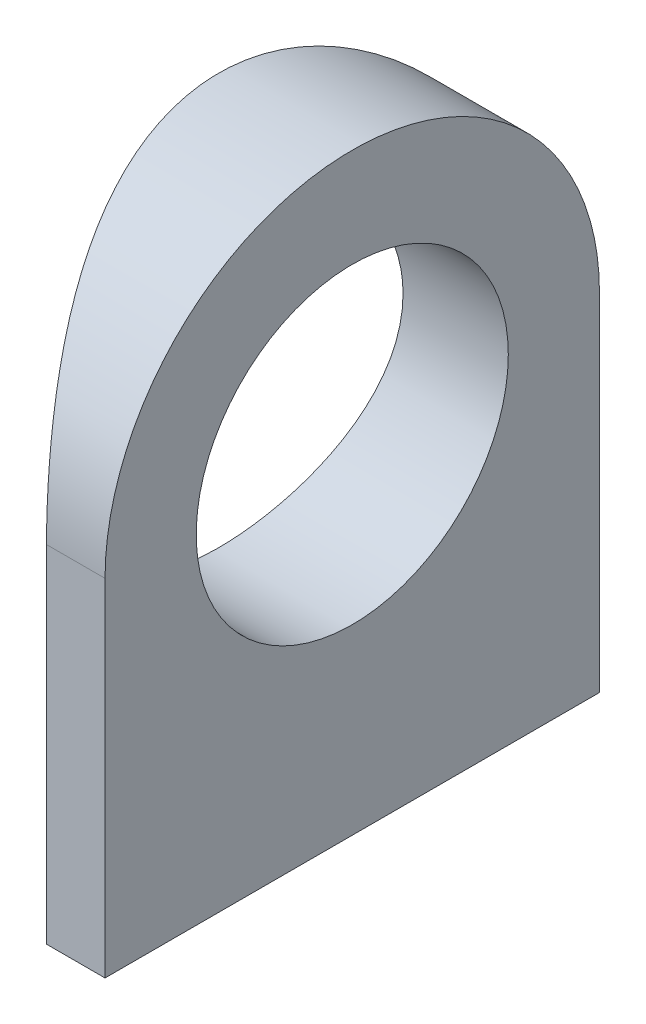
ISO-10303-21;
HEADER;
FILE_DESCRIPTION(('STEP AP214'),'2;1');
FILE_NAME('part.step','',(''),(''),'','','');
FILE_SCHEMA(('AUTOMOTIVE_DESIGN { 1 0 10303 214 1 1 1 1 }'));
ENDSEC;
DATA;
#1=APPLICATION_CONTEXT('core data for automotive mechanical design processes');
#2=APPLICATION_PROTOCOL_DEFINITION('international standard','automotive_design',2000,#1);
#3=PRODUCT_CONTEXT('',#1,'mechanical');
#4=PRODUCT('Part','Part','',(#3));
#5=PRODUCT_RELATED_PRODUCT_CATEGORY('part','',(#4));
#6=PRODUCT_DEFINITION_FORMATION('','',#4);
#7=PRODUCT_DEFINITION_CONTEXT('part definition',#1,'design');
#8=PRODUCT_DEFINITION('design','',#6,#7);
#9=PRODUCT_DEFINITION_SHAPE('','',#8);
#10=(LENGTH_UNIT() NAMED_UNIT(*) SI_UNIT(.MILLI.,.METRE.));
#11=(NAMED_UNIT(*) PLANE_ANGLE_UNIT() SI_UNIT($,.RADIAN.));
#12=(NAMED_UNIT(*) SI_UNIT($,.STERADIAN.) SOLID_ANGLE_UNIT());
#13=UNCERTAINTY_MEASURE_WITH_UNIT(LENGTH_MEASURE(1.E-05),#10,'distance_accuracy_value','');
#14=(GEOMETRIC_REPRESENTATION_CONTEXT(3) GLOBAL_UNCERTAINTY_ASSIGNED_CONTEXT((#13)) GLOBAL_UNIT_ASSIGNED_CONTEXT((#10,
#11,#12)) REPRESENTATION_CONTEXT('',''));
#15=CARTESIAN_POINT('',(0.,0.,0.));
#16=DIRECTION('',(0.,0.,1.));
#17=DIRECTION('',(1.,0.,0.));
#18=AXIS2_PLACEMENT_3D('',#15,#16,#17);
#19=CARTESIAN_POINT('',(-31.75,25.4,-15.875));
#20=DIRECTION('',(0.,0.,-1.));
#21=DIRECTION('',(0.,1.,0.));
#22=AXIS2_PLACEMENT_3D('',#19,#20,#21);
#23=PLANE('',#22);
#24=DIRECTION('',(0.,-1.,0.));
#25=VECTOR('',#24,1.);
#26=CARTESIAN_POINT('',(-20.0025,47.625,-15.875));
#27=LINE('',#26,#25);
#28=CARTESIAN_POINT('',(-20.0025,47.625,-15.875));
#29=VERTEX_POINT('',#28);
#30=CARTESIAN_POINT('',(-20.0025,25.4,-15.875));
#31=VERTEX_POINT('',#30);
#32=EDGE_CURVE('E93',#29,#31,#27,.T.);
#33=ORIENTED_EDGE('',*,*,#32,.T.);
#34=DIRECTION('',(-1.,0.,0.));
#35=VECTOR('',#34,1.);
#36=CARTESIAN_POINT('',(-31.75,25.4,-15.875));
#37=LINE('',#36,#35);
#38=CARTESIAN_POINT('',(-23.7595244060145,25.4,-15.875));
#39=VERTEX_POINT('',#38);
#40=EDGE_CURVE('E96',#39,#31,#37,.F.);
#41=ORIENTED_EDGE('',*,*,#40,.F.);
#42=DIRECTION('',(0.,1.,0.));
#43=VECTOR('',#42,1.);
#44=CARTESIAN_POINT('',(-23.7595244060145,25.4,-15.875));
#45=LINE('',#44,#43);
#46=CARTESIAN_POINT('',(-23.7595244060145,47.625,-15.875));
#47=VERTEX_POINT('',#46);
#48=EDGE_CURVE('E110',#39,#47,#45,.T.);
#49=ORIENTED_EDGE('',*,*,#48,.T.);
#50=DIRECTION('',(-1.,0.,0.));
#51=VECTOR('',#50,1.);
#52=CARTESIAN_POINT('',(-20.0025,47.625,-15.875));
#53=LINE('',#52,#51);
#54=EDGE_CURVE('E98',#29,#47,#53,.T.);
#55=ORIENTED_EDGE('',*,*,#54,.F.);
#56=EDGE_LOOP('',(#33,#41,#49,#55));
#57=FACE_BOUND('',#56,.T.);
#58=ADVANCED_FACE('F49',(#57),#23,.T.);
#59=CARTESIAN_POINT('',(-31.75,25.4,15.875));
#60=DIRECTION('',(0.,0.,-1.));
#61=DIRECTION('',(0.,1.,0.));
#62=AXIS2_PLACEMENT_3D('',#59,#60,#61);
#63=PLANE('',#62);
#64=DIRECTION('',(1.,0.,0.));
#65=VECTOR('',#64,1.);
#66=CARTESIAN_POINT('',(-31.75,25.4,15.875));
#67=LINE('',#66,#65);
#68=CARTESIAN_POINT('',(-23.7595244060145,25.4,15.875));
#69=VERTEX_POINT('',#68);
#70=CARTESIAN_POINT('',(-20.0025,25.4,15.875));
#71=VERTEX_POINT('',#70);
#72=EDGE_CURVE('E116',#69,#71,#67,.T.);
#73=ORIENTED_EDGE('',*,*,#72,.T.);
#74=DIRECTION('',(0.,-1.,0.));
#75=VECTOR('',#74,1.);
#76=CARTESIAN_POINT('',(-20.0025,47.625,15.875));
#77=LINE('',#76,#75);
#78=CARTESIAN_POINT('',(-20.0025,47.625,15.875));
#79=VERTEX_POINT('',#78);
#80=EDGE_CURVE('E65',#79,#71,#77,.T.);
#81=ORIENTED_EDGE('',*,*,#80,.F.);
#82=DIRECTION('',(1.,0.,0.));
#83=VECTOR('',#82,1.);
#84=CARTESIAN_POINT('',(-23.7595244060145,47.625,15.875));
#85=LINE('',#84,#83);
#86=CARTESIAN_POINT('',(-23.7595244060145,47.6249999499818,15.875));
#87=VERTEX_POINT('',#86);
#88=EDGE_CURVE('E232',#87,#79,#85,.T.);
#89=ORIENTED_EDGE('',*,*,#88,.F.);
#90=DIRECTION('',(0.,1.,0.));
#91=VECTOR('',#90,1.);
#92=CARTESIAN_POINT('',(-23.7595244060145,0.,15.875));
#93=LINE('',#92,#91);
#94=EDGE_CURVE('E111',#69,#87,#93,.T.);
#95=ORIENTED_EDGE('',*,*,#94,.F.);
#96=EDGE_LOOP('',(#73,#81,#89,#95));
#97=FACE_BOUND('',#96,.T.);
#98=ADVANCED_FACE('F325',(#97),#63,.F.);
#99=CARTESIAN_POINT('',(0.,25.4,0.));
#100=DIRECTION('',(0.,1.,0.));
#101=DIRECTION('',(0.,0.,1.));
#102=AXIS2_PLACEMENT_3D('',#99,#100,#101);
#103=PLANE('',#102);
#104=DIRECTION('',(0.,0.,-1.));
#105=VECTOR('',#104,1.);
#106=CARTESIAN_POINT('',(-20.0025,25.4,0.));
#107=LINE('',#106,#105);
#108=EDGE_CURVE('E13',#71,#31,#107,.T.);
#109=ORIENTED_EDGE('',*,*,#108,.F.);
#110=ORIENTED_EDGE('',*,*,#72,.F.);
#111=CARTESIAN_POINT('',(0.,25.4,0.));
#112=DIRECTION('',(0.,1.,0.));
#113=DIRECTION('',(0.,0.,1.));
#114=AXIS2_PLACEMENT_3D('',#111,#112,#113);
#115=CIRCLE('',#114,28.575);
#116=EDGE_CURVE('E108',#69,#39,#115,.F.);
#117=ORIENTED_EDGE('',*,*,#116,.T.);
#118=ORIENTED_EDGE('',*,*,#40,.T.);
#119=EDGE_LOOP('',(#109,#110,#117,#118));
#120=FACE_BOUND('',#119,.T.);
#121=ADVANCED_FACE('F106',(#120),#103,.F.);
#122=CARTESIAN_POINT('',(-20.0025,47.1297,0.));
#123=DIRECTION('',(1.,0.,0.));
#124=DIRECTION('',(0.,0.,-1.));
#125=AXIS2_PLACEMENT_3D('',#122,#123,#124);
#126=CYLINDRICAL_SURFACE('',#125,10.0203);
#127=CARTESIAN_POINT('',(-28.575,57.15,0.));
#128=CARTESIAN_POINT('',(-28.5750003769053,57.1500005370179,-0.272542580301307));
#129=CARTESIAN_POINT('',(-28.5710921026778,57.1388719135384,-0.545077232973781));
#130=CARTESIAN_POINT('',(-28.5555672786092,57.0944701216604,-1.08810614157751));
#131=CARTESIAN_POINT('',(-28.543951027361,57.0611978110676,-1.35860047613644));
#132=CARTESIAN_POINT('',(-28.5133263736555,56.9728337343441,-1.89556540860215));
#133=CARTESIAN_POINT('',(-28.4943180967233,56.9177423387258,-2.16203607475552));
#134=CARTESIAN_POINT('',(-28.4494194083427,56.7862556104633,-2.68907296900862));
#135=CARTESIAN_POINT('',(-28.4235288955786,56.7098599641915,-2.9496391101246));
#136=CARTESIAN_POINT('',(-28.3656071016424,56.5366176339601,-3.46257836307413));
#137=CARTESIAN_POINT('',(-28.3335882913714,56.43981244287,-3.71496691690442));
#138=CARTESIAN_POINT('',(-28.2641878986499,56.2264183004266,-4.21057598944201));
#139=CARTESIAN_POINT('',(-28.226804330537,56.1098220208472,-4.45379307122661));
#140=CARTESIAN_POINT('',(-28.1476288851639,55.8577644679301,-4.92947819425555));
#141=CARTESIAN_POINT('',(-28.1058371521325,55.722303811761,-5.16194658682361));
#142=CARTESIAN_POINT('',(-28.0188805190509,55.4334591704653,-5.61481388809595));
#143=CARTESIAN_POINT('',(-27.973715403817,55.2800740416075,-5.83521202529772));
#144=CARTESIAN_POINT('',(-27.8795438131527,54.9508550394437,-6.26999308069988));
#145=CARTESIAN_POINT('',(-27.8304588635998,54.7744339872572,-6.48391453827705));
#146=CARTESIAN_POINT('',(-27.7311569276317,54.4046274596829,-6.89627046301699));
#147=CARTESIAN_POINT('',(-27.6809399208312,54.2112416786251,-7.09470465100869));
#148=CARTESIAN_POINT('',(-27.5806869585863,53.8086290151856,-7.47495885402908));
#149=CARTESIAN_POINT('',(-27.5306510534197,53.5993980416442,-7.65677455130901));
#150=CARTESIAN_POINT('',(-27.4321207341675,53.1663775695903,-8.00260658048227));
#151=CARTESIAN_POINT('',(-27.383626281544,52.942588435473,-8.16662335761422));
#152=CARTESIAN_POINT('',(-27.2879761772424,52.4742000243072,-8.48085132228964));
#153=CARTESIAN_POINT('',(-27.2409163549299,52.2291592833852,-8.63043461999241));
#154=CARTESIAN_POINT('',(-27.1513282875395,51.726602179468,-8.90827179629806));
#155=CARTESIAN_POINT('',(-27.1087982444624,51.469090825903,-9.03653414921574));
#156=CARTESIAN_POINT('',(-27.0296085940403,50.9432376892577,-9.27071591701391));
#157=CARTESIAN_POINT('',(-26.9929486628891,50.6748965045939,-9.37663656440606));
#158=CARTESIAN_POINT('',(-26.9267240361208,50.1292916758061,-9.56515310908848));
#159=CARTESIAN_POINT('',(-26.8971589827597,49.8520284823551,-9.647750182457));
#160=CARTESIAN_POINT('',(-26.8470905991548,49.3010017520397,-9.78619291309816));
#161=CARTESIAN_POINT('',(-26.8262943558777,49.0274836334412,-9.84290960452032));
#162=CARTESIAN_POINT('',(-26.7929377229637,48.476172379954,-9.93335018543851));
#163=CARTESIAN_POINT('',(-26.7803771457846,48.1983793425609,-9.96707459851404));
#164=CARTESIAN_POINT('',(-26.7639266511237,47.6407729998991,-10.011164335457));
#165=CARTESIAN_POINT('',(-26.7600341212134,47.3609603288331,-10.0215366973172));
#166=CARTESIAN_POINT('',(-26.7610482194471,46.8014692415412,-10.0188286959631));
#167=CARTESIAN_POINT('',(-26.7659545636023,46.5217908212737,-10.0057490896747));
#168=CARTESIAN_POINT('',(-26.7839189945324,45.9791132820727,-9.95755588423566));
#169=CARTESIAN_POINT('',(-26.7965454644125,45.7159952654964,-9.92360845622233));
#170=CARTESIAN_POINT('',(-26.8291680952328,45.1937326403634,-9.83506926325033));
#171=CARTESIAN_POINT('',(-26.8491639662562,44.9345878759142,-9.78047831041857));
#172=CARTESIAN_POINT('',(-26.8959206769241,44.4220300913195,-9.65115509233153));
#173=CARTESIAN_POINT('',(-26.9226809435909,44.1686165876877,-9.57642453296506));
#174=CARTESIAN_POINT('',(-26.9821977519606,43.6690160893215,-9.40742525633424));
#175=CARTESIAN_POINT('',(-27.0149565776803,43.4228318887954,-9.31314909505521));
#176=CARTESIAN_POINT('',(-27.0861424111536,42.9351709660053,-9.10406001452647));
#177=CARTESIAN_POINT('',(-27.1246559555825,42.6938444004612,-8.98892656739629));
#178=CARTESIAN_POINT('',(-27.2058685398715,42.2216249320124,-8.74004994147303));
#179=CARTESIAN_POINT('',(-27.2485690053535,41.9907356223013,-8.60630041746771));
#180=CARTESIAN_POINT('',(-27.3370075918407,41.5407418951983,-8.32111307575267));
#181=CARTESIAN_POINT('',(-27.382745980513,41.3216385193342,-8.16967369852146));
#182=CARTESIAN_POINT('',(-27.4760799209676,40.8964190451799,-7.85005541004414));
#183=CARTESIAN_POINT('',(-27.5236755422306,40.6903034335284,-7.68187587216901));
#184=CARTESIAN_POINT('',(-27.6223353480655,40.280537823105,-7.31946057552177));
#185=CARTESIAN_POINT('',(-27.6734397449088,40.0777350917257,-7.12427664595855));
#186=CARTESIAN_POINT('',(-27.7749784539836,39.6892451961118,-6.7175230655042));
#187=CARTESIAN_POINT('',(-27.8254129693718,39.5035527364469,-6.50595852177917));
#188=CARTESIAN_POINT('',(-27.9242884150687,39.1503241122104,-6.06755711822143));
#189=CARTESIAN_POINT('',(-27.97272834127,38.9827970247045,-5.84071271413099));
#190=CARTESIAN_POINT('',(-28.0662571283072,38.6672369182757,-5.37332347084147));
#191=CARTESIAN_POINT('',(-28.1113473167709,38.5191961580348,-5.13278412695607));
#192=CARTESIAN_POINT('',(-28.1974928457197,38.2419573133927,-4.63640359040143));
#193=CARTESIAN_POINT('',(-28.2384918925899,38.1130127059742,-4.38041086238284));
#194=CARTESIAN_POINT('',(-28.3146515178034,37.8772554603426,-3.85757860127941));
#195=CARTESIAN_POINT('',(-28.3498120090002,37.7704431524708,-3.59073890636647));
#196=CARTESIAN_POINT('',(-28.4132639331723,37.5799658994651,-3.04821505536707));
#197=CARTESIAN_POINT('',(-28.4415575149081,37.4962937122888,-2.77253369662123));
#198=CARTESIAN_POINT('',(-28.4904502612479,37.3528858411743,-2.21434815259443));
#199=CARTESIAN_POINT('',(-28.5110498221685,37.2931489243265,-1.9318443195352));
#200=CARTESIAN_POINT('',(-28.5431555920924,37.2004849924646,-1.3757720535719));
#201=CARTESIAN_POINT('',(-28.5550465345313,37.1664214297934,-1.10241477808029));
#202=CARTESIAN_POINT('',(-28.5709556187576,37.1209163237262,-0.553597897949885));
#203=CARTESIAN_POINT('',(-28.5749740095536,37.1094740648186,-0.278138360082291));
#204=CARTESIAN_POINT('',(-28.5750257354493,37.1093266623508,0.272739559537233));
#205=CARTESIAN_POINT('',(-28.5710604119081,37.1206176993258,0.548157940428928));
#206=CARTESIAN_POINT('',(-28.5552582046047,37.1658148938186,1.09690173166424));
#207=CARTESIAN_POINT('',(-28.5434214155337,37.199720779287,1.37022716714533));
#208=CARTESIAN_POINT('',(-28.5127208840487,37.2883230459275,1.90379251683555));
#209=CARTESIAN_POINT('',(-28.494101510327,37.3422976294695,2.16416686189257));
#210=CARTESIAN_POINT('',(-28.450280136372,37.470618125727,2.67937511538178));
#211=CARTESIAN_POINT('',(-28.425075802192,37.544971261793,2.9342070246153));
#212=CARTESIAN_POINT('',(-28.3687309700711,37.7133857137134,3.43650819020407));
#213=CARTESIAN_POINT('',(-28.3375921586566,37.8074414310185,3.68397951532859));
#214=CARTESIAN_POINT('',(-28.2701306101412,38.0145665238441,4.17020554409905));
#215=CARTESIAN_POINT('',(-28.2338058765973,38.1276432249429,4.40895684610627));
#216=CARTESIAN_POINT('',(-28.1558108415313,38.3752922661911,4.88263442269371));
#217=CARTESIAN_POINT('',(-28.1140216803512,38.5103671537528,5.11727834453038));
#218=CARTESIAN_POINT('',(-28.0269438424245,38.7987774444076,5.57451711701523));
#219=CARTESIAN_POINT('',(-27.9816536097006,38.9521209831914,5.79710653468962));
#220=CARTESIAN_POINT('',(-27.8887147655709,39.2760217129869,6.22888355430686));
#221=CARTESIAN_POINT('',(-27.8410659942597,39.4465800719544,6.43807024535291));
#222=CARTESIAN_POINT('',(-27.7445956391725,39.8038583522798,6.84186653075906));
#223=CARTESIAN_POINT('',(-27.6957740199598,39.9905787624078,7.03647568393542));
#224=CARTESIAN_POINT('',(-27.595698013514,40.3889754782988,7.41951673647884));
#225=CARTESIAN_POINT('',(-27.5444460044684,40.6014376185372,7.60713290496283));
#226=CARTESIAN_POINT('',(-27.4434511282913,41.0416245827192,7.96379092493729));
#227=CARTESIAN_POINT('',(-27.3937077333368,41.2693439769488,8.13283932834326));
#228=CARTESIAN_POINT('',(-27.2971218706936,41.738834261154,8.4513596947611));
#229=CARTESIAN_POINT('',(-27.2502807529955,41.9806115902984,8.60082258310178));
#230=CARTESIAN_POINT('',(-27.1609456983712,42.476507434444,8.87890670712165));
#231=CARTESIAN_POINT('',(-27.1184499372689,42.730620704211,9.00753670177925));
#232=CARTESIAN_POINT('',(-27.0390945386307,43.24972306845,9.24302154591905));
#233=CARTESIAN_POINT('',(-27.0022370707784,43.5147163001591,9.34986801807362));
#234=CARTESIAN_POINT('',(-26.9353826693593,44.0536470395885,9.54075602590967));
#235=CARTESIAN_POINT('',(-26.9053857725306,44.3275845951964,9.62479743947087));
#236=CARTESIAN_POINT('',(-26.8532879771732,44.8822459466333,9.76920928077558));
#237=CARTESIAN_POINT('',(-26.8311836712477,45.1629667579665,9.82958992446871));
#238=CARTESIAN_POINT('',(-26.7956368309458,45.7290862854557,9.92608325655762));
#239=CARTESIAN_POINT('',(-26.7821937953003,46.0144847299143,9.96219734937968));
#240=CARTESIAN_POINT('',(-26.7649575441778,46.5713483675687,10.0084082195126));
#241=CARTESIAN_POINT('',(-26.7606603873763,46.8426860188374,10.0198641146324));
#242=CARTESIAN_POINT('',(-26.7603432704955,47.3853946258612,10.020711412496));
#243=CARTESIAN_POINT('',(-26.7643229828894,47.6567655798736,10.0101036883266));
#244=CARTESIAN_POINT('',(-26.7804284544037,48.1974870279113,9.96693546964691));
#245=CARTESIAN_POINT('',(-26.7925536184635,48.4668376680761,9.93437657876386));
#246=CARTESIAN_POINT('',(-26.8245568505652,49.0015627061064,9.84763456668122));
#247=CARTESIAN_POINT('',(-26.8444349334042,49.2669370963821,9.79345140420984));
#248=CARTESIAN_POINT('',(-26.8907622718652,49.7856459827564,9.66550757417424));
#249=CARTESIAN_POINT('',(-26.9170456969576,50.0391168376855,9.59223816902426));
#250=CARTESIAN_POINT('',(-26.9756483494417,50.5389554866214,9.42617470976873));
#251=CARTESIAN_POINT('',(-27.0079697079921,50.7853207370692,9.33337376030865));
#252=CARTESIAN_POINT('',(-27.0777343405746,51.269368265776,9.1289965567445));
#253=CARTESIAN_POINT('',(-27.1151774784441,51.5070507746529,9.01742080175088));
#254=CARTESIAN_POINT('',(-27.1941805960726,51.9724101156187,8.77628947859421));
#255=CARTESIAN_POINT('',(-27.2357408752064,52.2000862183585,8.64673260267159));
#256=CARTESIAN_POINT('',(-27.3239440168734,52.6547123441996,8.36395023854647));
#257=CARTESIAN_POINT('',(-27.3707343559195,52.8811176243888,8.20989455799547));
#258=CARTESIAN_POINT('',(-27.4663745720854,53.3202949338459,7.88401685033748));
#259=CARTESIAN_POINT('',(-27.5152245013331,53.5330666177051,7.71219437339477));
#260=CARTESIAN_POINT('',(-27.6137050765388,53.943822734208,7.35178994672646));
#261=CARTESIAN_POINT('',(-27.663335937204,54.1418030109985,7.16320331922615));
#262=CARTESIAN_POINT('',(-27.7620789770202,54.5217549571143,6.77042081771733));
#263=CARTESIAN_POINT('',(-27.8111911610074,54.7037267758197,6.5662250893956));
#264=CARTESIAN_POINT('',(-27.9098210967133,55.0583959741838,6.13382953771633));
#265=CARTESIAN_POINT('',(-27.9592570095777,55.2303034427126,5.90496214018851));
#266=CARTESIAN_POINT('',(-28.0547929571005,55.554136406699,5.43297004989914));
#267=CARTESIAN_POINT('',(-28.1008942284799,55.7060693274011,5.18985070396102));
#268=CARTESIAN_POINT('',(-28.1884917560724,55.9888726158022,4.6908135202234));
#269=CARTESIAN_POINT('',(-28.22998744704,56.1197403990503,4.43489411704457));
#270=CARTESIAN_POINT('',(-28.3071811071243,56.3592802468734,3.91202578666745));
#271=CARTESIAN_POINT('',(-28.3428792232887,56.4679528744169,3.64507713942677));
#272=CARTESIAN_POINT('',(-28.4071348034401,56.6611911897317,3.10462024109784));
#273=CARTESIAN_POINT('',(-28.4357562942547,56.7459740815808,2.83119734345441));
#274=CARTESIAN_POINT('',(-28.4854547021083,56.8919555234308,2.27744618567513));
#275=CARTESIAN_POINT('',(-28.5065316255264,56.9531540933728,1.99711793137817));
#276=CARTESIAN_POINT('',(-28.5405079745063,57.0513180875267,1.43184298183865));
#277=CARTESIAN_POINT('',(-28.5534098349442,57.0882907273472,1.14689768769989));
#278=CARTESIAN_POINT('',(-28.5706554598541,57.1376308566407,0.574631921962532));
#279=CARTESIAN_POINT('',(-28.5749996026704,57.1499994338812,0.287311555931954));
#280=CARTESIAN_POINT('',(-28.575,57.15,0.));
#281=B_SPLINE_CURVE_WITH_KNOTS('',3,(#127,#128,#129,#130,#131,#132,#133,#134,#135,#136,#137,
#138,#139,#140,#141,#142,#143,#144,#145,#146,#147,#148,#149,#150,#151,#152,#153,#154,#155,#156,
#157,#158,#159,#160,#161,#162,#163,#164,#165,#166,#167,#168,#169,#170,#171,#172,#173,#174,#175,
#176,#177,#178,#179,#180,#181,#182,#183,#184,#185,#186,#187,#188,#189,#190,#191,#192,#193,#194,
#195,#196,#197,#198,#199,#200,#201,#202,#203,#204,#205,#206,#207,#208,#209,#210,#211,#212,#213,
#214,#215,#216,#217,#218,#219,#220,#221,#222,#223,#224,#225,#226,#227,#228,#229,#230,#231,#232,
#233,#234,#235,#236,#237,#238,#239,#240,#241,#242,#243,#244,#245,#246,#247,#248,#249,#250,#251,
#252,#253,#254,#255,#256,#257,#258,#259,#260,#261,#262,#263,#264,#265,#266,#267,#268,#269,#270,
#271,#272,#273,#274,#275,#276,#277,#278,#279,#280),.UNSPECIFIED.,.T.,.F.,(4,2,2,2,2,2,2,2,2,2,2,
2,2,2,2,2,2,2,2,2,2,2,2,2,2,2,2,2,2,2,2,2,2,2,2,2,2,2,2,2,2,2,2,2,2,2,2,2,2,2,2,2,2,2,2,2,2,2,2,
2,2,2,2,2,2,2,2,2,2,2,2,2,2,2,2,2,4),(0.,0.817360154196786,1.63468864721018,2.45200326167372,
3.26932990876299,4.08501067244342,4.90099412715721,5.71695089235695,6.53295975088256,
7.37679685701378,8.22064917050711,9.06472011074397,9.90876993174188,10.7804568326073,
11.651796436295,12.5230879587266,13.3943355389196,14.2335870073551,15.0728193637422,
15.9117987529545,16.750751064107,17.5466146686534,18.3424469667726,19.1382118765371,
19.93428041489,20.7438200813094,21.5536363547552,22.3635240748307,23.1734421225803,
24.0306687198426,24.8876291180272,25.7450157768601,26.602060787685,27.4696213359896,
28.3371948323597,29.2044965007405,30.0717534885278,30.8979036095454,31.7240275990272,
32.5500128014114,33.3759880676344,34.1747496338023,34.9737946947534,35.7726130118264,
36.5717396862732,37.392682070422,38.2139914261964,39.0353565419841,39.8567465060452,
40.719853907147,41.5826557626781,42.4458559822703,43.3086923306458,44.17185987819,
45.0350320478745,45.8978311162057,46.7605802457512,47.5744099704802,48.3882074914945,
49.2019455675355,50.0156851966733,50.8102552987332,51.605106385253,52.3999363447452,
53.1948241422175,54.0273465989179,54.8598901393334,55.6926667216533,56.5254355322421,
57.3958108697353,58.2658617375887,59.136019269478,60.0061547275285,60.8681029788579,
61.7300505013849,62.5917411790146,63.4533937596845),.UNSPECIFIED.);
#282=CARTESIAN_POINT('',(-28.575,57.15,0.));
#283=VERTEX_POINT('',#282);
#284=EDGE_CURVE('E59',#283,#283,#281,.T.);
#285=ORIENTED_EDGE('',*,*,#284,.T.);
#286=EDGE_LOOP('',(#285));
#287=FACE_BOUND('',#286,.T.);
#288=CARTESIAN_POINT('',(-20.0025,47.1297,0.));
#289=DIRECTION('',(1.,0.,0.));
#290=DIRECTION('',(0.,0.,-1.));
#291=AXIS2_PLACEMENT_3D('',#288,#289,#290);
#292=CIRCLE('',#291,10.0203);
#293=CARTESIAN_POINT('',(-20.0025,47.1297,-10.0203));
#294=VERTEX_POINT('',#293);
#295=EDGE_CURVE('E238',#294,#294,#292,.T.);
#296=ORIENTED_EDGE('',*,*,#295,.T.);
#297=EDGE_LOOP('',(#296));
#298=FACE_BOUND('',#297,.T.);
#299=ADVANCED_FACE('F286',(#287,#298),#126,.F.);
#300=CARTESIAN_POINT('',(-103.07574,47.625,0.));
#301=DIRECTION('',(1.,0.,0.));
#302=DIRECTION('',(0.,1.,0.));
#303=AXIS2_PLACEMENT_3D('',#300,#301,#302);
#304=CYLINDRICAL_SURFACE('',#303,15.875);
#305=ORIENTED_EDGE('',*,*,#88,.T.);
#306=CARTESIAN_POINT('',(-20.0025,47.625,0.));
#307=DIRECTION('',(-1.,0.,0.));
#308=DIRECTION('',(0.,0.,1.));
#309=AXIS2_PLACEMENT_3D('',#306,#307,#308);
#310=CIRCLE('',#309,15.875);
#311=EDGE_CURVE('E101',#79,#29,#310,.T.);
#312=ORIENTED_EDGE('',*,*,#311,.T.);
#313=ORIENTED_EDGE('',*,*,#54,.T.);
#314=CARTESIAN_POINT('',(-23.7595244060145,47.6249998999637,15.875));
#315=CARTESIAN_POINT('',(-23.7595185448408,47.8291036770083,15.8750019818497));
#316=CARTESIAN_POINT('',(-23.7621555677835,48.0331772528118,15.8710628459035));
#317=CARTESIAN_POINT('',(-23.7726559485967,48.4408758036094,15.8553330117305));
#318=CARTESIAN_POINT('',(-23.7805190154021,48.6445008029534,15.8435427507727));
#319=CARTESIAN_POINT('',(-23.81183700237,49.2537349374491,15.796473065563));
#320=CARTESIAN_POINT('',(-23.8430209529656,49.6581264616603,15.7494946005441));
#321=CARTESIAN_POINT('',(-23.9244640570722,50.4573261896031,15.6254934783618));
#322=CARTESIAN_POINT('',(-23.974589415492,50.8521814065561,15.5486814508966));
#323=CARTESIAN_POINT('',(-24.0920463193551,51.6325591467859,15.3660566060038));
#324=CARTESIAN_POINT('',(-24.1593805706716,52.0180801919408,15.2602392276746));
#325=CARTESIAN_POINT('',(-24.3086993994503,52.7762781836424,15.0212357095824));
#326=CARTESIAN_POINT('',(-24.3906399091248,53.1489898501287,14.8881317184445));
#327=CARTESIAN_POINT('',(-24.56675706768,53.8809387885527,14.5956906468379));
#328=CARTESIAN_POINT('',(-24.6609334578545,54.2401763451698,14.4363541209908));
#329=CARTESIAN_POINT('',(-24.8590615892095,54.9443100060096,14.0924487032961));
#330=CARTESIAN_POINT('',(-24.9630292122492,55.2891814541687,13.907838588539));
#331=CARTESIAN_POINT('',(-25.1780281862409,55.9628695726825,13.514722615091));
#332=CARTESIAN_POINT('',(-25.2890621406214,56.2916802460265,13.3062079263654));
#333=CARTESIAN_POINT('',(-25.5272180298296,56.9648539207943,12.8439126480301));
#334=CARTESIAN_POINT('',(-25.6548236922428,57.307366278067,12.5876834958716));
#335=CARTESIAN_POINT('',(-25.9122324264308,57.9701467163814,12.0488995313986));
#336=CARTESIAN_POINT('',(-26.0420356300572,58.29041345677,11.7663431348464));
#337=CARTESIAN_POINT('',(-26.3007944901739,58.9075218679498,11.1759896807242));
#338=CARTESIAN_POINT('',(-26.4297496446081,59.2043506387862,10.8681789108975));
#339=CARTESIAN_POINT('',(-26.683709878482,59.7728401456166,10.228809440469));
#340=CARTESIAN_POINT('',(-26.8087162332799,60.0445090634913,9.89725852269759));
#341=CARTESIAN_POINT('',(-27.0627817777256,60.5841968074196,9.18113866650199));
#342=CARTESIAN_POINT('',(-27.191213242992,60.8497438839013,8.79447676539875));
#343=CARTESIAN_POINT('',(-27.4365111320135,61.3470234619668,7.99642045913538));
#344=CARTESIAN_POINT('',(-27.5533763216602,61.5787523564381,7.58502342227623));
#345=CARTESIAN_POINT('',(-27.7720562196279,62.0057405085137,6.74044391280156));
#346=CARTESIAN_POINT('',(-27.8738869345947,62.2010386118691,6.30728527740402));
#347=CARTESIAN_POINT('',(-28.0595483723368,62.5530150963361,5.42187986157792));
#348=CARTESIAN_POINT('',(-28.1433839042228,62.7097037972519,4.96963821972989));
#349=CARTESIAN_POINT('',(-28.2748618686478,62.9534359947625,4.14703101319992));
#350=CARTESIAN_POINT('',(-28.3264088390093,63.0481997289634,3.77955640211455));
#351=CARTESIAN_POINT('',(-28.415592869053,63.2113916555142,3.03716877832181));
#352=CARTESIAN_POINT('',(-28.4532320837548,63.2798239280162,2.6622569275158));
#353=CARTESIAN_POINT('',(-28.5137792287744,63.3896028311817,1.90743913943163));
#354=CARTESIAN_POINT('',(-28.536692286447,63.4309588893376,1.52753498743793));
#355=CARTESIAN_POINT('',(-28.5673037308093,63.4861590903336,0.765092078485112));
#356=CARTESIAN_POINT('',(-28.5750008672972,63.5000009724979,0.382553107629642));
#357=CARTESIAN_POINT('',(-28.574999066243,63.499998952981,-0.411867595819017));
#358=CARTESIAN_POINT('',(-28.5660751528653,63.4839522513364,-0.823751577983296));
#359=CARTESIAN_POINT('',(-28.5306089992547,63.4199786446207,-1.64427573885206));
#360=CARTESIAN_POINT('',(-28.5040658504815,63.372050095554,-2.05291574918064));
#361=CARTESIAN_POINT('',(-28.4340284627053,63.2449163484863,-2.86398532598182));
#362=CARTESIAN_POINT('',(-28.3905272958769,63.1656983677008,-3.26641228430745));
#363=CARTESIAN_POINT('',(-28.2876592524114,62.9769679206335,-4.06200293302823));
#364=CARTESIAN_POINT('',(-28.2282924047016,62.8674555095864,-4.45516664031126));
#365=CARTESIAN_POINT('',(-28.0953741751962,62.6198627779261,-5.22817395777548));
#366=CARTESIAN_POINT('',(-28.0218787077089,62.4818949184797,-5.60806332027958));
#367=CARTESIAN_POINT('',(-27.8622238364241,62.1785269955806,-6.35394248297272));
#368=CARTESIAN_POINT('',(-27.7760644587703,62.0131269887597,-6.71993231185447));
#369=CARTESIAN_POINT('',(-27.5929384848958,61.6563467377969,-7.43619756558275));
#370=CARTESIAN_POINT('',(-27.4959714620555,61.4649654680086,-7.78647236933016));
#371=CARTESIAN_POINT('',(-27.2932260693504,61.0576612139534,-8.46979823228569));
#372=CARTESIAN_POINT('',(-27.1874467316444,60.8417355330649,-8.80284739310355));
#373=CARTESIAN_POINT('',(-26.9616084686243,60.3709371418519,-9.47289834336419));
#374=CARTESIAN_POINT('',(-26.8410680194894,60.1144013019711,-9.8085695051383));
#375=CARTESIAN_POINT('',(-26.595009068123,59.5764320413013,-10.4573665820182));
#376=CARTESIAN_POINT('',(-26.4694903727019,59.2949976537577,-10.7704916208519));
#377=CARTESIAN_POINT('',(-26.216123735071,58.7083303222796,-11.3733239087808));
#378=CARTESIAN_POINT('',(-26.0882733330439,58.4030709806898,-11.6630044369007));
#379=CARTESIAN_POINT('',(-25.8333047141191,57.7703672384249,-12.2173689499306));
#380=CARTESIAN_POINT('',(-25.7061865252563,57.4429219943442,-12.4820519836347));
#381=CARTESIAN_POINT('',(-25.4429137606699,56.7324968892019,-13.0109442424794));
#382=CARTESIAN_POINT('',(-25.3071620280713,56.3472605856592,-13.2723448766066));
#383=CARTESIAN_POINT('',(-25.1102416173758,55.7517658363795,-13.6391230347781));
#384=CARTESIAN_POINT('',(-25.0457148478277,55.5503120781976,-13.757169702933));
#385=CARTESIAN_POINT('',(-24.9194093676402,55.1416320313167,-13.9846554376819));
#386=CARTESIAN_POINT('',(-24.85763192587,54.9344031475805,-14.0940905474079));
#387=CARTESIAN_POINT('',(-24.6776424055115,54.3057125583593,-14.4084282066058));
#388=CARTESIAN_POINT('',(-24.5643812947645,53.8760788244994,-14.6000836342976));
#389=CARTESIAN_POINT('',(-24.35570711803,52.9978211380031,-14.9456004789768));
#390=CARTESIAN_POINT('',(-24.2602882130315,52.5492034571676,-15.0994742655018));
#391=CARTESIAN_POINT('',(-24.1098460428674,51.7351369706453,-15.3382294183625));
#392=CARTESIAN_POINT('',(-24.0505498065135,51.3727318374999,-15.4308356953714));
#393=CARTESIAN_POINT('',(-23.947347135101,50.6402638477636,-15.5905180691957));
#394=CARTESIAN_POINT('',(-23.903436343078,50.2702031906101,-15.6576013942532));
#395=CARTESIAN_POINT('',(-23.8322547560556,49.5225061141589,-15.7657385918544));
#396=CARTESIAN_POINT('',(-23.8050787143758,49.1448388372315,-15.8066442951334));
#397=CARTESIAN_POINT('',(-23.7777995531943,48.5761723128363,-15.8476214428595));
#398=CARTESIAN_POINT('',(-23.7709539392459,48.3861629334676,-15.8578836159963));
#399=CARTESIAN_POINT('',(-23.7618139915424,48.005777151371,-15.8715738776787));
#400=CARTESIAN_POINT('',(-23.7595199426175,47.8154007264202,-15.8750015385308));
#401=CARTESIAN_POINT('',(-23.7595244060145,47.625,-15.875));
#402=B_SPLINE_CURVE_WITH_KNOTS('',3,(#314,#315,#316,#317,#318,#319,#320,#321,#322,#323,#324,
#325,#326,#327,#328,#329,#330,#331,#332,#333,#334,#335,#336,#337,#338,#339,#340,#341,#342,#343,
#344,#345,#346,#347,#348,#349,#350,#351,#352,#353,#354,#355,#356,#357,#358,#359,#360,#361,#362,
#363,#364,#365,#366,#367,#368,#369,#370,#371,#372,#373,#374,#375,#376,#377,#378,#379,#380,#381,
#382,#383,#384,#385,#386,#387,#388,#389,#390,#391,#392,#393,#394,#395,#396,#397,#398,#399,#400,
#401),.UNSPECIFIED.,.F.,.F.,(4,2,2,2,2,2,2,2,2,2,2,2,2,2,2,2,2,2,2,2,2,2,2,2,2,2,2,2,2,2,2,2,2,
2,2,2,2,2,2,2,2,2,2,4),(0.,0.612196826178042,1.22435955885571,2.44742016883442,3.66199830231812,
4.8767675299284,6.08793193020882,7.29907072672166,8.51220904440137,9.7257969320967,
11.0635477239972,12.4013790668912,13.7399416754439,15.0780674491197,16.535157752716,
17.9924033589631,19.448086125476,20.9033793833375,22.0511715195189,23.1987857296026,
24.3460001464914,25.4933088192516,26.7285340867705,27.9638230539384,29.1996172010102,
30.435409094925,31.6664074171355,32.8974031980662,34.1284475884046,35.3596273608965,
36.6762759189191,37.9929756218937,39.3111555019479,40.629385521256,42.0822322267829,
42.8087624157068,43.5356245072485,44.9850823391406,46.4340649904703,47.5690559734098,
48.7037252808985,49.8447614721035,50.415835308239,50.9869448801999),.UNSPECIFIED.);
#403=EDGE_CURVE('E74',#87,#47,#402,.T.);
#404=ORIENTED_EDGE('',*,*,#403,.F.);
#405=EDGE_LOOP('',(#305,#312,#313,#404));
#406=FACE_BOUND('',#405,.T.);
#407=ADVANCED_FACE('F281',(#406),#304,.T.);
#408=CARTESIAN_POINT('',(-20.0025,63.5,-31.75));
#409=DIRECTION('',(-1.,0.,0.));
#410=DIRECTION('',(0.,-1.,0.));
#411=AXIS2_PLACEMENT_3D('',#408,#409,#410);
#412=PLANE('',#411);
#413=ORIENTED_EDGE('',*,*,#295,.F.);
#414=EDGE_LOOP('',(#413));
#415=FACE_BOUND('',#414,.T.);
#416=ORIENTED_EDGE('',*,*,#80,.T.);
#417=ORIENTED_EDGE('',*,*,#108,.T.);
#418=ORIENTED_EDGE('',*,*,#32,.F.);
#419=ORIENTED_EDGE('',*,*,#311,.F.);
#420=EDGE_LOOP('',(#416,#417,#418,#419));
#421=FACE_BOUND('',#420,.T.);
#422=ADVANCED_FACE('F103',(#415,#421),#412,.F.);
#423=CARTESIAN_POINT('',(0.,0.,0.));
#424=DIRECTION('',(0.,1.,0.));
#425=DIRECTION('',(1.,0.,0.));
#426=AXIS2_PLACEMENT_3D('',#423,#424,#425);
#427=CYLINDRICAL_SURFACE('',#426,28.575);
#428=ORIENTED_EDGE('',*,*,#116,.F.);
#429=ORIENTED_EDGE('',*,*,#94,.T.);
#430=ORIENTED_EDGE('',*,*,#403,.T.);
#431=ORIENTED_EDGE('',*,*,#48,.F.);
#432=EDGE_LOOP('',(#428,#429,#430,#431));
#433=FACE_BOUND('',#432,.T.);
#434=ORIENTED_EDGE('',*,*,#284,.F.);
#435=EDGE_LOOP('',(#434));
#436=FACE_BOUND('',#435,.T.);
#437=ADVANCED_FACE('F51',(#433,#436),#427,.T.);
#438=CLOSED_SHELL('',(#58,#98,#121,#299,#407,#422,#437));
#439=MANIFOLD_SOLID_BREP('B2',#438);
#440=ADVANCED_BREP_SHAPE_REPRESENTATION('',(#18,#439),#14);
#441=SHAPE_DEFINITION_REPRESENTATION(#9,#440);
ENDSEC;
END-ISO-10303-21;
